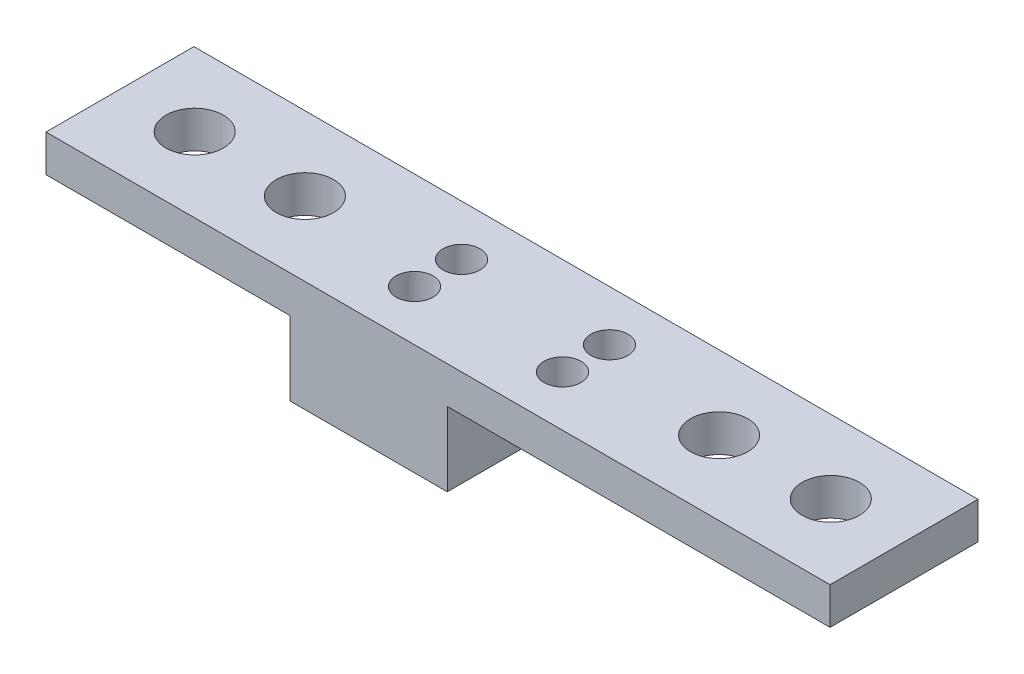
ISO-10303-21;
HEADER;
FILE_DESCRIPTION(('STEP AP214'),'2;1');
FILE_NAME('part.step','',(''),(''),'','','');
FILE_SCHEMA(('AUTOMOTIVE_DESIGN { 1 0 10303 214 1 1 1 1 }'));
ENDSEC;
DATA;
#1=APPLICATION_CONTEXT('core data for automotive mechanical design processes');
#2=APPLICATION_PROTOCOL_DEFINITION('international standard','automotive_design',2000,#1);
#3=PRODUCT_CONTEXT('',#1,'mechanical');
#4=PRODUCT('Part','Part','',(#3));
#5=PRODUCT_RELATED_PRODUCT_CATEGORY('part','',(#4));
#6=PRODUCT_DEFINITION_FORMATION('','',#4);
#7=PRODUCT_DEFINITION_CONTEXT('part definition',#1,'design');
#8=PRODUCT_DEFINITION('design','',#6,#7);
#9=PRODUCT_DEFINITION_SHAPE('','',#8);
#10=(LENGTH_UNIT() NAMED_UNIT(*) SI_UNIT(.MILLI.,.METRE.));
#11=(NAMED_UNIT(*) PLANE_ANGLE_UNIT() SI_UNIT($,.RADIAN.));
#12=(NAMED_UNIT(*) SI_UNIT($,.STERADIAN.) SOLID_ANGLE_UNIT());
#13=UNCERTAINTY_MEASURE_WITH_UNIT(LENGTH_MEASURE(1.E-05),#10,'distance_accuracy_value','');
#14=(GEOMETRIC_REPRESENTATION_CONTEXT(3) GLOBAL_UNCERTAINTY_ASSIGNED_CONTEXT((#13)) GLOBAL_UNIT_ASSIGNED_CONTEXT((#10,
#11,#12)) REPRESENTATION_CONTEXT('',''));
#15=CARTESIAN_POINT('',(0.,0.,0.));
#16=DIRECTION('',(0.,0.,1.));
#17=DIRECTION('',(1.,0.,0.));
#18=AXIS2_PLACEMENT_3D('',#15,#16,#17);
#19=CARTESIAN_POINT('',(0.,0.,0.));
#20=DIRECTION('',(0.,-1.,0.));
#21=DIRECTION('',(0.,0.,-1.));
#22=AXIS2_PLACEMENT_3D('',#19,#20,#21);
#23=PLANE('',#22);
#24=CARTESIAN_POINT('',(-11.2,0.,0.));
#25=DIRECTION('',(0.,1.,0.));
#26=DIRECTION('',(0.,0.,1.));
#27=AXIS2_PLACEMENT_3D('',#24,#25,#26);
#28=CIRCLE('',#27,1.55);
#29=CARTESIAN_POINT('',(-11.2,0.,1.55));
#30=VERTEX_POINT('',#29);
#31=EDGE_CURVE('E190',#30,#30,#28,.T.);
#32=ORIENTED_EDGE('',*,*,#31,.T.);
#33=EDGE_LOOP('',(#32));
#34=FACE_BOUND('',#33,.T.);
#35=DIRECTION('',(-1.,0.,0.));
#36=VECTOR('',#35,1.);
#37=CARTESIAN_POINT('',(-15.2,0.,-4.));
#38=LINE('',#37,#36);
#39=CARTESIAN_POINT('',(-8.,0.,-4.00000000000001));
#40=VERTEX_POINT('',#39);
#41=CARTESIAN_POINT('',(-21.2,0.,-4.));
#42=VERTEX_POINT('',#41);
#43=EDGE_CURVE('E105',#40,#42,#38,.T.);
#44=ORIENTED_EDGE('',*,*,#43,.F.);
#45=DIRECTION('',(0.,0.,-1.));
#46=VECTOR('',#45,1.);
#47=CARTESIAN_POINT('',(-8.,0.,-4.00000000000001));
#48=LINE('',#47,#46);
#49=CARTESIAN_POINT('',(-8.,0.,4.00000000000001));
#50=VERTEX_POINT('',#49);
#51=EDGE_CURVE('E141',#50,#40,#48,.T.);
#52=ORIENTED_EDGE('',*,*,#51,.F.);
#53=DIRECTION('',(1.,0.,0.));
#54=VECTOR('',#53,1.);
#55=CARTESIAN_POINT('',(-15.2,0.,4.00000000000001));
#56=LINE('',#55,#54);
#57=CARTESIAN_POINT('',(-21.2,0.,4.00000000000001));
#58=VERTEX_POINT('',#57);
#59=EDGE_CURVE('E37',#58,#50,#56,.T.);
#60=ORIENTED_EDGE('',*,*,#59,.F.);
#61=DIRECTION('',(0.,0.,1.));
#62=VECTOR('',#61,1.);
#63=CARTESIAN_POINT('',(-21.2,0.,4.00000000000001));
#64=LINE('',#63,#62);
#65=EDGE_CURVE('E134',#42,#58,#64,.T.);
#66=ORIENTED_EDGE('',*,*,#65,.F.);
#67=EDGE_LOOP('',(#44,#52,#60,#66));
#68=FACE_BOUND('',#67,.T.);
#69=CARTESIAN_POINT('',(-17.2,0.,-0.0401412742934725));
#70=DIRECTION('',(0.,-1.,0.));
#71=DIRECTION('',(0.,0.,-1.));
#72=AXIS2_PLACEMENT_3D('',#69,#70,#71);
#73=CIRCLE('',#72,1.55);
#74=CARTESIAN_POINT('',(-17.2,0.,1.50985872570653));
#75=VERTEX_POINT('',#74);
#76=EDGE_CURVE('E126',#75,#75,#73,.F.);
#77=ORIENTED_EDGE('',*,*,#76,.T.);
#78=EDGE_LOOP('',(#77));
#79=FACE_BOUND('',#78,.T.);
#80=ADVANCED_FACE('F33',(#34,#68,#79),#23,.T.);
#81=DIRECTION('',(0.,0.,1.));
#82=VECTOR('',#81,1.);
#83=CARTESIAN_POINT('',(0.5,0.,-4.00000000000001));
#84=LINE('',#83,#82);
#85=CARTESIAN_POINT('',(0.5,0.,-4.));
#86=VERTEX_POINT('',#85);
#87=CARTESIAN_POINT('',(0.499999999999999,0.,4.00000000000001));
#88=VERTEX_POINT('',#87);
#89=EDGE_CURVE('E50',#86,#88,#84,.T.);
#90=ORIENTED_EDGE('',*,*,#89,.F.);
#91=CARTESIAN_POINT('',(21.2,0.,-4.00000000000001));
#92=VERTEX_POINT('',#91);
#93=EDGE_CURVE('E95',#92,#86,#38,.T.);
#94=ORIENTED_EDGE('',*,*,#93,.F.);
#95=DIRECTION('',(0.,0.,-1.));
#96=VECTOR('',#95,1.);
#97=CARTESIAN_POINT('',(21.2,0.,4.));
#98=LINE('',#97,#96);
#99=CARTESIAN_POINT('',(21.2,0.,4.));
#100=VERTEX_POINT('',#99);
#101=EDGE_CURVE('E100',#100,#92,#98,.T.);
#102=ORIENTED_EDGE('',*,*,#101,.F.);
#103=EDGE_CURVE('E55',#88,#100,#56,.T.);
#104=ORIENTED_EDGE('',*,*,#103,.F.);
#105=EDGE_LOOP('',(#90,#94,#102,#104));
#106=FACE_BOUND('',#105,.T.);
#107=CARTESIAN_POINT('',(4.,0.,1.27));
#108=DIRECTION('',(0.,1.,0.));
#109=DIRECTION('',(0.,0.,1.));
#110=AXIS2_PLACEMENT_3D('',#107,#108,#109);
#111=CIRCLE('',#110,1.);
#112=CARTESIAN_POINT('',(4.,0.,2.27));
#113=VERTEX_POINT('',#112);
#114=EDGE_CURVE('E168',#113,#113,#111,.T.);
#115=ORIENTED_EDGE('',*,*,#114,.T.);
#116=EDGE_LOOP('',(#115));
#117=FACE_BOUND('',#116,.T.);
#118=CARTESIAN_POINT('',(11.2,0.,0.));
#119=DIRECTION('',(0.,1.,0.));
#120=DIRECTION('',(0.,0.,-1.));
#121=AXIS2_PLACEMENT_3D('',#118,#119,#120);
#122=CIRCLE('',#121,1.55);
#123=CARTESIAN_POINT('',(11.2,0.,-1.55));
#124=VERTEX_POINT('',#123);
#125=EDGE_CURVE('E186',#124,#124,#122,.T.);
#126=ORIENTED_EDGE('',*,*,#125,.T.);
#127=EDGE_LOOP('',(#126));
#128=FACE_BOUND('',#127,.T.);
#129=CARTESIAN_POINT('',(4.,0.,-1.27));
#130=DIRECTION('',(0.,1.,0.));
#131=DIRECTION('',(0.,0.,1.));
#132=AXIS2_PLACEMENT_3D('',#129,#130,#131);
#133=CIRCLE('',#132,1.);
#134=CARTESIAN_POINT('',(4.,0.,-0.270000000000001));
#135=VERTEX_POINT('',#134);
#136=EDGE_CURVE('E172',#135,#135,#133,.T.);
#137=ORIENTED_EDGE('',*,*,#136,.T.);
#138=EDGE_LOOP('',(#137));
#139=FACE_BOUND('',#138,.T.);
#140=CARTESIAN_POINT('',(17.2,0.,-0.0401412742934767));
#141=DIRECTION('',(0.,-1.,0.));
#142=DIRECTION('',(0.,0.,-1.));
#143=AXIS2_PLACEMENT_3D('',#140,#141,#142);
#144=CIRCLE('',#143,1.55);
#145=CARTESIAN_POINT('',(17.2,0.,1.50985872570652));
#146=VERTEX_POINT('',#145);
#147=EDGE_CURVE('E120',#146,#146,#144,.F.);
#148=ORIENTED_EDGE('',*,*,#147,.T.);
#149=EDGE_LOOP('',(#148));
#150=FACE_BOUND('',#149,.T.);
#151=ADVANCED_FACE('F97',(#106,#117,#128,#139,#150),#23,.T.);
#152=CARTESIAN_POINT('',(0.,2.,0.));
#153=DIRECTION('',(0.,-1.,0.));
#154=DIRECTION('',(0.,0.,-1.));
#155=AXIS2_PLACEMENT_3D('',#152,#153,#154);
#156=PLANE('',#155);
#157=DIRECTION('',(1.,0.,0.));
#158=VECTOR('',#157,1.);
#159=CARTESIAN_POINT('',(-15.2,2.,4.00000000000001));
#160=LINE('',#159,#158);
#161=CARTESIAN_POINT('',(-21.2,2.,4.00000000000001));
#162=VERTEX_POINT('',#161);
#163=CARTESIAN_POINT('',(21.2,2.,4.));
#164=VERTEX_POINT('',#163);
#165=EDGE_CURVE('E11',#162,#164,#160,.T.);
#166=ORIENTED_EDGE('',*,*,#165,.T.);
#167=DIRECTION('',(0.,0.,-1.));
#168=VECTOR('',#167,1.);
#169=CARTESIAN_POINT('',(21.2,2.,4.));
#170=LINE('',#169,#168);
#171=CARTESIAN_POINT('',(21.2,2.,-4.00000000000001));
#172=VERTEX_POINT('',#171);
#173=EDGE_CURVE('E226',#164,#172,#170,.T.);
#174=ORIENTED_EDGE('',*,*,#173,.T.);
#175=DIRECTION('',(-1.,0.,0.));
#176=VECTOR('',#175,1.);
#177=CARTESIAN_POINT('',(-15.2,2.,-4.));
#178=LINE('',#177,#176);
#179=CARTESIAN_POINT('',(-21.2,2.,-4.));
#180=VERTEX_POINT('',#179);
#181=EDGE_CURVE('E42',#172,#180,#178,.T.);
#182=ORIENTED_EDGE('',*,*,#181,.T.);
#183=DIRECTION('',(0.,0.,1.));
#184=VECTOR('',#183,1.);
#185=CARTESIAN_POINT('',(-21.2,2.,4.00000000000001));
#186=LINE('',#185,#184);
#187=EDGE_CURVE('E123',#180,#162,#186,.T.);
#188=ORIENTED_EDGE('',*,*,#187,.T.);
#189=EDGE_LOOP('',(#166,#174,#182,#188));
#190=FACE_BOUND('',#189,.T.);
#191=CARTESIAN_POINT('',(-11.2,2.,0.));
#192=DIRECTION('',(0.,1.,0.));
#193=DIRECTION('',(0.,0.,1.));
#194=AXIS2_PLACEMENT_3D('',#191,#192,#193);
#195=CIRCLE('',#194,1.55);
#196=CARTESIAN_POINT('',(-11.2,2.,1.55));
#197=VERTEX_POINT('',#196);
#198=EDGE_CURVE('E193',#197,#197,#195,.T.);
#199=ORIENTED_EDGE('',*,*,#198,.F.);
#200=EDGE_LOOP('',(#199));
#201=FACE_BOUND('',#200,.T.);
#202=CARTESIAN_POINT('',(11.2,2.,0.));
#203=DIRECTION('',(0.,1.,0.));
#204=DIRECTION('',(0.,0.,-1.));
#205=AXIS2_PLACEMENT_3D('',#202,#203,#204);
#206=CIRCLE('',#205,1.55);
#207=CARTESIAN_POINT('',(11.2,2.,-1.55));
#208=VERTEX_POINT('',#207);
#209=EDGE_CURVE('E187',#208,#208,#206,.T.);
#210=ORIENTED_EDGE('',*,*,#209,.F.);
#211=EDGE_LOOP('',(#210));
#212=FACE_BOUND('',#211,.T.);
#213=CARTESIAN_POINT('',(-4.,2.,1.27));
#214=DIRECTION('',(0.,1.,0.));
#215=DIRECTION('',(0.,0.,1.));
#216=AXIS2_PLACEMENT_3D('',#213,#214,#215);
#217=CIRCLE('',#216,1.);
#218=CARTESIAN_POINT('',(-4.,2.,2.27));
#219=VERTEX_POINT('',#218);
#220=EDGE_CURVE('E183',#219,#219,#217,.T.);
#221=ORIENTED_EDGE('',*,*,#220,.F.);
#222=EDGE_LOOP('',(#221));
#223=FACE_BOUND('',#222,.T.);
#224=CARTESIAN_POINT('',(-4.,2.,-1.27));
#225=DIRECTION('',(0.,1.,0.));
#226=DIRECTION('',(0.,0.,1.));
#227=AXIS2_PLACEMENT_3D('',#224,#225,#226);
#228=CIRCLE('',#227,1.);
#229=CARTESIAN_POINT('',(-4.,2.,-0.27));
#230=VERTEX_POINT('',#229);
#231=EDGE_CURVE('E178',#230,#230,#228,.T.);
#232=ORIENTED_EDGE('',*,*,#231,.F.);
#233=EDGE_LOOP('',(#232));
#234=FACE_BOUND('',#233,.T.);
#235=CARTESIAN_POINT('',(4.,2.,-1.27));
#236=DIRECTION('',(0.,1.,0.));
#237=DIRECTION('',(0.,0.,1.));
#238=AXIS2_PLACEMENT_3D('',#235,#236,#237);
#239=CIRCLE('',#238,1.);
#240=CARTESIAN_POINT('',(4.,2.,-0.270000000000001));
#241=VERTEX_POINT('',#240);
#242=EDGE_CURVE('E175',#241,#241,#239,.T.);
#243=ORIENTED_EDGE('',*,*,#242,.F.);
#244=EDGE_LOOP('',(#243));
#245=FACE_BOUND('',#244,.T.);
#246=CARTESIAN_POINT('',(4.,2.,1.27));
#247=DIRECTION('',(0.,1.,0.));
#248=DIRECTION('',(0.,0.,1.));
#249=AXIS2_PLACEMENT_3D('',#246,#247,#248);
#250=CIRCLE('',#249,1.);
#251=CARTESIAN_POINT('',(4.,2.,2.27));
#252=VERTEX_POINT('',#251);
#253=EDGE_CURVE('E169',#252,#252,#250,.T.);
#254=ORIENTED_EDGE('',*,*,#253,.F.);
#255=EDGE_LOOP('',(#254));
#256=FACE_BOUND('',#255,.T.);
#257=CARTESIAN_POINT('',(-17.2,2.,-0.0401412742934725));
#258=DIRECTION('',(0.,1.,0.));
#259=DIRECTION('',(0.,0.,1.));
#260=AXIS2_PLACEMENT_3D('',#257,#258,#259);
#261=CIRCLE('',#260,1.55);
#262=CARTESIAN_POINT('',(-17.2,2.,1.50985872570653));
#263=VERTEX_POINT('',#262);
#264=EDGE_CURVE('E127',#263,#263,#261,.T.);
#265=ORIENTED_EDGE('',*,*,#264,.F.);
#266=EDGE_LOOP('',(#265));
#267=FACE_BOUND('',#266,.T.);
#268=CARTESIAN_POINT('',(17.2,2.,-0.0401412742934767));
#269=DIRECTION('',(0.,1.,0.));
#270=DIRECTION('',(0.,0.,-1.));
#271=AXIS2_PLACEMENT_3D('',#268,#269,#270);
#272=CIRCLE('',#271,1.55);
#273=CARTESIAN_POINT('',(17.2,2.,1.50985872570652));
#274=VERTEX_POINT('',#273);
#275=EDGE_CURVE('E112',#274,#274,#272,.T.);
#276=ORIENTED_EDGE('',*,*,#275,.F.);
#277=EDGE_LOOP('',(#276));
#278=FACE_BOUND('',#277,.T.);
#279=ADVANCED_FACE('F224',(#190,#201,#212,#223,#234,#245,#256,#267,#278),#156,.F.);
#280=CARTESIAN_POINT('',(-15.2,2.,-4.));
#281=DIRECTION('',(0.,0.,1.));
#282=DIRECTION('',(1.,0.,0.));
#283=AXIS2_PLACEMENT_3D('',#280,#281,#282);
#284=PLANE('',#283);
#285=DIRECTION('',(0.,1.,0.));
#286=VECTOR('',#285,1.);
#287=CARTESIAN_POINT('',(-8.,-14.9658560997307,-4.00000000000001));
#288=LINE('',#287,#286);
#289=CARTESIAN_POINT('',(-8.,-4.,-4.00000000000001));
#290=VERTEX_POINT('',#289);
#291=EDGE_CURVE('E144',#290,#40,#288,.T.);
#292=ORIENTED_EDGE('',*,*,#291,.T.);
#293=ORIENTED_EDGE('',*,*,#43,.T.);
#294=DIRECTION('',(0.,1.,0.));
#295=VECTOR('',#294,1.);
#296=CARTESIAN_POINT('',(-21.2,-10.,-4.));
#297=LINE('',#296,#295);
#298=EDGE_CURVE('E130',#42,#180,#297,.T.);
#299=ORIENTED_EDGE('',*,*,#298,.T.);
#300=ORIENTED_EDGE('',*,*,#181,.F.);
#301=DIRECTION('',(0.,1.,0.));
#302=VECTOR('',#301,1.);
#303=CARTESIAN_POINT('',(21.2,-10.,-4.00000000000001));
#304=LINE('',#303,#302);
#305=EDGE_CURVE('E107',#92,#172,#304,.T.);
#306=ORIENTED_EDGE('',*,*,#305,.F.);
#307=ORIENTED_EDGE('',*,*,#93,.T.);
#308=DIRECTION('',(0.,1.,0.));
#309=VECTOR('',#308,1.);
#310=CARTESIAN_POINT('',(0.5,-4.,-4.00000000000001));
#311=LINE('',#310,#309);
#312=CARTESIAN_POINT('',(0.5,-4.,-4.00000000000001));
#313=VERTEX_POINT('',#312);
#314=EDGE_CURVE('E163',#313,#86,#311,.T.);
#315=ORIENTED_EDGE('',*,*,#314,.F.);
#316=DIRECTION('',(1.,0.,0.));
#317=VECTOR('',#316,1.);
#318=CARTESIAN_POINT('',(-0.5,-4.,-4.00000000000001));
#319=LINE('',#318,#317);
#320=EDGE_CURVE('E161',#290,#313,#319,.T.);
#321=ORIENTED_EDGE('',*,*,#320,.F.);
#322=EDGE_LOOP('',(#292,#293,#299,#300,#306,#307,#315,#321));
#323=FACE_BOUND('',#322,.T.);
#324=ADVANCED_FACE('F35',(#323),#284,.F.);
#325=CARTESIAN_POINT('',(-15.2,2.,4.00000000000001));
#326=DIRECTION('',(0.,0.,-1.));
#327=DIRECTION('',(-1.,0.,0.));
#328=AXIS2_PLACEMENT_3D('',#325,#326,#327);
#329=PLANE('',#328);
#330=ORIENTED_EDGE('',*,*,#59,.T.);
#331=DIRECTION('',(0.,1.,0.));
#332=VECTOR('',#331,1.);
#333=CARTESIAN_POINT('',(-8.,-14.9658560997307,4.00000000000001));
#334=LINE('',#333,#332);
#335=CARTESIAN_POINT('',(-8.,-4.,4.00000000000001));
#336=VERTEX_POINT('',#335);
#337=EDGE_CURVE('E145',#336,#50,#334,.T.);
#338=ORIENTED_EDGE('',*,*,#337,.F.);
#339=DIRECTION('',(-1.,0.,0.));
#340=VECTOR('',#339,1.);
#341=CARTESIAN_POINT('',(-0.5,-4.,4.00000000000001));
#342=LINE('',#341,#340);
#343=CARTESIAN_POINT('',(0.5,-4.,4.00000000000001));
#344=VERTEX_POINT('',#343);
#345=EDGE_CURVE('E159',#344,#336,#342,.T.);
#346=ORIENTED_EDGE('',*,*,#345,.F.);
#347=DIRECTION('',(0.,1.,0.));
#348=VECTOR('',#347,1.);
#349=CARTESIAN_POINT('',(0.5,-4.,4.00000000000001));
#350=LINE('',#349,#348);
#351=EDGE_CURVE('E166',#344,#88,#350,.T.);
#352=ORIENTED_EDGE('',*,*,#351,.T.);
#353=ORIENTED_EDGE('',*,*,#103,.T.);
#354=DIRECTION('',(0.,1.,0.));
#355=VECTOR('',#354,1.);
#356=CARTESIAN_POINT('',(21.2,-10.,4.));
#357=LINE('',#356,#355);
#358=EDGE_CURVE('E116',#100,#164,#357,.T.);
#359=ORIENTED_EDGE('',*,*,#358,.T.);
#360=ORIENTED_EDGE('',*,*,#165,.F.);
#361=DIRECTION('',(0.,1.,0.));
#362=VECTOR('',#361,1.);
#363=CARTESIAN_POINT('',(-21.2,-10.,4.00000000000001));
#364=LINE('',#363,#362);
#365=EDGE_CURVE('E137',#58,#162,#364,.T.);
#366=ORIENTED_EDGE('',*,*,#365,.F.);
#367=EDGE_LOOP('',(#330,#338,#346,#352,#353,#359,#360,#366));
#368=FACE_BOUND('',#367,.T.);
#369=ADVANCED_FACE('F203',(#368),#329,.F.);
#370=CARTESIAN_POINT('',(-11.2,2.,0.));
#371=DIRECTION('',(0.,-1.,0.));
#372=DIRECTION('',(0.,0.,-1.));
#373=AXIS2_PLACEMENT_3D('',#370,#371,#372);
#374=CYLINDRICAL_SURFACE('',#373,1.55);
#375=ORIENTED_EDGE('',*,*,#198,.T.);
#376=EDGE_LOOP('',(#375));
#377=FACE_BOUND('',#376,.T.);
#378=ORIENTED_EDGE('',*,*,#31,.F.);
#379=EDGE_LOOP('',(#378));
#380=FACE_BOUND('',#379,.T.);
#381=ADVANCED_FACE('F249',(#377,#380),#374,.F.);
#382=CARTESIAN_POINT('',(11.2,2.,0.));
#383=DIRECTION('',(0.,-1.,0.));
#384=DIRECTION('',(0.,0.,-1.));
#385=AXIS2_PLACEMENT_3D('',#382,#383,#384);
#386=CYLINDRICAL_SURFACE('',#385,1.55);
#387=ORIENTED_EDGE('',*,*,#209,.T.);
#388=EDGE_LOOP('',(#387));
#389=FACE_BOUND('',#388,.T.);
#390=ORIENTED_EDGE('',*,*,#125,.F.);
#391=EDGE_LOOP('',(#390));
#392=FACE_BOUND('',#391,.T.);
#393=ADVANCED_FACE('F254',(#389,#392),#386,.F.);
#394=CARTESIAN_POINT('',(-4.,2.,1.27));
#395=DIRECTION('',(0.,-1.,0.));
#396=DIRECTION('',(0.,0.,-1.));
#397=AXIS2_PLACEMENT_3D('',#394,#395,#396);
#398=CYLINDRICAL_SURFACE('',#397,1.);
#399=ORIENTED_EDGE('',*,*,#220,.T.);
#400=EDGE_LOOP('',(#399));
#401=FACE_BOUND('',#400,.T.);
#402=CARTESIAN_POINT('',(-4.,-4.,1.27));
#403=DIRECTION('',(0.,1.,0.));
#404=DIRECTION('',(0.,0.,1.));
#405=AXIS2_PLACEMENT_3D('',#402,#403,#404);
#406=CIRCLE('',#405,1.);
#407=CARTESIAN_POINT('',(-4.,-4.,2.27));
#408=VERTEX_POINT('',#407);
#409=EDGE_CURVE('E151',#408,#408,#406,.T.);
#410=ORIENTED_EDGE('',*,*,#409,.F.);
#411=EDGE_LOOP('',(#410));
#412=FACE_BOUND('',#411,.T.);
#413=ADVANCED_FACE('F259',(#401,#412),#398,.F.);
#414=CARTESIAN_POINT('',(-4.,2.,-1.27));
#415=DIRECTION('',(0.,-1.,0.));
#416=DIRECTION('',(0.,0.,-1.));
#417=AXIS2_PLACEMENT_3D('',#414,#415,#416);
#418=CYLINDRICAL_SURFACE('',#417,1.);
#419=ORIENTED_EDGE('',*,*,#231,.T.);
#420=EDGE_LOOP('',(#419));
#421=FACE_BOUND('',#420,.T.);
#422=CARTESIAN_POINT('',(-4.,-4.,-1.27));
#423=DIRECTION('',(0.,1.,0.));
#424=DIRECTION('',(0.,0.,1.));
#425=AXIS2_PLACEMENT_3D('',#422,#423,#424);
#426=CIRCLE('',#425,1.);
#427=CARTESIAN_POINT('',(-4.,-4.,-0.27));
#428=VERTEX_POINT('',#427);
#429=EDGE_CURVE('E148',#428,#428,#426,.T.);
#430=ORIENTED_EDGE('',*,*,#429,.F.);
#431=EDGE_LOOP('',(#430));
#432=FACE_BOUND('',#431,.T.);
#433=ADVANCED_FACE('F266',(#421,#432),#418,.F.);
#434=CARTESIAN_POINT('',(4.,2.,-1.27));
#435=DIRECTION('',(0.,-1.,0.));
#436=DIRECTION('',(0.,0.,-1.));
#437=AXIS2_PLACEMENT_3D('',#434,#435,#436);
#438=CYLINDRICAL_SURFACE('',#437,1.);
#439=ORIENTED_EDGE('',*,*,#242,.T.);
#440=EDGE_LOOP('',(#439));
#441=FACE_BOUND('',#440,.T.);
#442=ORIENTED_EDGE('',*,*,#136,.F.);
#443=EDGE_LOOP('',(#442));
#444=FACE_BOUND('',#443,.T.);
#445=ADVANCED_FACE('F270',(#441,#444),#438,.F.);
#446=CARTESIAN_POINT('',(4.,2.,1.27));
#447=DIRECTION('',(0.,-1.,0.));
#448=DIRECTION('',(0.,0.,-1.));
#449=AXIS2_PLACEMENT_3D('',#446,#447,#448);
#450=CYLINDRICAL_SURFACE('',#449,1.);
#451=ORIENTED_EDGE('',*,*,#253,.T.);
#452=EDGE_LOOP('',(#451));
#453=FACE_BOUND('',#452,.T.);
#454=ORIENTED_EDGE('',*,*,#114,.F.);
#455=EDGE_LOOP('',(#454));
#456=FACE_BOUND('',#455,.T.);
#457=ADVANCED_FACE('F274',(#453,#456),#450,.F.);
#458=CARTESIAN_POINT('',(0.5,-4.,-4.00000000000001));
#459=DIRECTION('',(-1.,0.,0.));
#460=DIRECTION('',(0.,0.,1.));
#461=AXIS2_PLACEMENT_3D('',#458,#459,#460);
#462=PLANE('',#461);
#463=ORIENTED_EDGE('',*,*,#89,.T.);
#464=ORIENTED_EDGE('',*,*,#351,.F.);
#465=DIRECTION('',(0.,0.,1.));
#466=VECTOR('',#465,1.);
#467=CARTESIAN_POINT('',(0.5,-4.,-4.00000000000001));
#468=LINE('',#467,#466);
#469=EDGE_CURVE('E156',#313,#344,#468,.T.);
#470=ORIENTED_EDGE('',*,*,#469,.F.);
#471=ORIENTED_EDGE('',*,*,#314,.T.);
#472=EDGE_LOOP('',(#463,#464,#470,#471));
#473=FACE_BOUND('',#472,.T.);
#474=ADVANCED_FACE('F207',(#473),#462,.F.);
#475=CARTESIAN_POINT('',(0.,-4.,0.));
#476=DIRECTION('',(0.,1.,0.));
#477=DIRECTION('',(0.,0.,1.));
#478=AXIS2_PLACEMENT_3D('',#475,#476,#477);
#479=PLANE('',#478);
#480=ORIENTED_EDGE('',*,*,#469,.T.);
#481=ORIENTED_EDGE('',*,*,#345,.T.);
#482=DIRECTION('',(0.,0.,1.));
#483=VECTOR('',#482,1.);
#484=CARTESIAN_POINT('',(-8.,-4.,-4.00000000000001));
#485=LINE('',#484,#483);
#486=EDGE_CURVE('E133',#290,#336,#485,.T.);
#487=ORIENTED_EDGE('',*,*,#486,.F.);
#488=ORIENTED_EDGE('',*,*,#320,.T.);
#489=EDGE_LOOP('',(#480,#481,#487,#488));
#490=FACE_BOUND('',#489,.T.);
#491=ORIENTED_EDGE('',*,*,#429,.T.);
#492=EDGE_LOOP('',(#491));
#493=FACE_BOUND('',#492,.T.);
#494=ORIENTED_EDGE('',*,*,#409,.T.);
#495=EDGE_LOOP('',(#494));
#496=FACE_BOUND('',#495,.T.);
#497=ADVANCED_FACE('F211',(#490,#493,#496),#479,.F.);
#498=CARTESIAN_POINT('',(-8.,-14.9658560997307,-4.00000000000001));
#499=DIRECTION('',(1.,0.,0.));
#500=DIRECTION('',(0.,0.,-1.));
#501=AXIS2_PLACEMENT_3D('',#498,#499,#500);
#502=PLANE('',#501);
#503=ORIENTED_EDGE('',*,*,#291,.F.);
#504=ORIENTED_EDGE('',*,*,#486,.T.);
#505=ORIENTED_EDGE('',*,*,#337,.T.);
#506=ORIENTED_EDGE('',*,*,#51,.T.);
#507=EDGE_LOOP('',(#503,#504,#505,#506));
#508=FACE_BOUND('',#507,.T.);
#509=ADVANCED_FACE('F214',(#508),#502,.F.);
#510=CARTESIAN_POINT('',(-21.2,-10.,4.00000000000001));
#511=DIRECTION('',(-1.,0.,0.));
#512=DIRECTION('',(0.,0.,1.));
#513=AXIS2_PLACEMENT_3D('',#510,#511,#512);
#514=PLANE('',#513);
#515=ORIENTED_EDGE('',*,*,#298,.F.);
#516=ORIENTED_EDGE('',*,*,#65,.T.);
#517=ORIENTED_EDGE('',*,*,#365,.T.);
#518=ORIENTED_EDGE('',*,*,#187,.F.);
#519=EDGE_LOOP('',(#515,#516,#517,#518));
#520=FACE_BOUND('',#519,.T.);
#521=ADVANCED_FACE('F223',(#520),#514,.T.);
#522=CARTESIAN_POINT('',(-17.2,-10.,-0.0401412742934725));
#523=DIRECTION('',(0.,1.,0.));
#524=DIRECTION('',(0.,0.,1.));
#525=AXIS2_PLACEMENT_3D('',#522,#523,#524);
#526=CYLINDRICAL_SURFACE('',#525,1.55);
#527=CARTESIAN_POINT('',(-17.2,2.,1.50985872570653));
#528=CARTESIAN_POINT('',(-17.2,1.97916666666667,1.50985872570653));
#529=CARTESIAN_POINT('',(-17.2,1.95833333333333,1.50985872570653));
#530=CARTESIAN_POINT('',(-17.2,1.91666666666666,1.50985872570653));
#531=CARTESIAN_POINT('',(-17.2,1.89583333333333,1.50985872570653));
#532=CARTESIAN_POINT('',(-17.2,1.85416666666666,1.50985872570653));
#533=CARTESIAN_POINT('',(-17.2,1.83333333333333,1.50985872570653));
#534=CARTESIAN_POINT('',(-17.2,1.79166666666666,1.50985872570653));
#535=CARTESIAN_POINT('',(-17.2,1.77083333333333,1.50985872570653));
#536=CARTESIAN_POINT('',(-17.2,1.72916666666666,1.50985872570653));
#537=CARTESIAN_POINT('',(-17.2,1.70833333333333,1.50985872570653));
#538=CARTESIAN_POINT('',(-17.2,1.66666666666666,1.50985872570653));
#539=CARTESIAN_POINT('',(-17.2,1.64583333333333,1.50985872570653));
#540=CARTESIAN_POINT('',(-17.2,1.60416666666666,1.50985872570653));
#541=CARTESIAN_POINT('',(-17.2,1.58333333333333,1.50985872570653));
#542=CARTESIAN_POINT('',(-17.2,1.54166666666666,1.50985872570653));
#543=CARTESIAN_POINT('',(-17.2,1.52083333333333,1.50985872570653));
#544=CARTESIAN_POINT('',(-17.2,1.47916666666667,1.50985872570653));
#545=CARTESIAN_POINT('',(-17.2,1.45833333333333,1.50985872570653));
#546=CARTESIAN_POINT('',(-17.2,1.41666666666667,1.50985872570653));
#547=CARTESIAN_POINT('',(-17.2,1.39583333333333,1.50985872570653));
#548=CARTESIAN_POINT('',(-17.2,1.35416666666667,1.50985872570653));
#549=CARTESIAN_POINT('',(-17.2,1.33333333333333,1.50985872570653));
#550=CARTESIAN_POINT('',(-17.2,1.29166666666667,1.50985872570653));
#551=CARTESIAN_POINT('',(-17.2,1.27083333333333,1.50985872570653));
#552=CARTESIAN_POINT('',(-17.2,1.22916666666667,1.50985872570653));
#553=CARTESIAN_POINT('',(-17.2,1.20833333333333,1.50985872570653));
#554=CARTESIAN_POINT('',(-17.2,1.16666666666667,1.50985872570653));
#555=CARTESIAN_POINT('',(-17.2,1.14583333333333,1.50985872570653));
#556=CARTESIAN_POINT('',(-17.2,1.10416666666667,1.50985872570653));
#557=CARTESIAN_POINT('',(-17.2,1.08333333333333,1.50985872570653));
#558=CARTESIAN_POINT('',(-17.2,1.04166666666667,1.50985872570653));
#559=CARTESIAN_POINT('',(-17.2,1.02083333333333,1.50985872570653));
#560=CARTESIAN_POINT('',(-17.2,0.979166666666666,1.50985872570653));
#561=CARTESIAN_POINT('',(-17.2,0.958333333333332,1.50985872570653));
#562=CARTESIAN_POINT('',(-17.2,0.916666666666666,1.50985872570653));
#563=CARTESIAN_POINT('',(-17.2,0.895833333333332,1.50985872570653));
#564=CARTESIAN_POINT('',(-17.2,0.854166666666666,1.50985872570653));
#565=CARTESIAN_POINT('',(-17.2,0.833333333333332,1.50985872570653));
#566=CARTESIAN_POINT('',(-17.2,0.791666666666666,1.50985872570653));
#567=CARTESIAN_POINT('',(-17.2,0.770833333333332,1.50985872570653));
#568=CARTESIAN_POINT('',(-17.2,0.729166666666666,1.50985872570653));
#569=CARTESIAN_POINT('',(-17.2,0.708333333333332,1.50985872570653));
#570=CARTESIAN_POINT('',(-17.2,0.666666666666666,1.50985872570653));
#571=CARTESIAN_POINT('',(-17.2,0.645833333333332,1.50985872570653));
#572=CARTESIAN_POINT('',(-17.2,0.604166666666666,1.50985872570653));
#573=CARTESIAN_POINT('',(-17.2,0.583333333333333,1.50985872570653));
#574=CARTESIAN_POINT('',(-17.2,0.541666666666667,1.50985872570653));
#575=CARTESIAN_POINT('',(-17.2,0.520833333333334,1.50985872570653));
#576=CARTESIAN_POINT('',(-17.2,0.479166666666667,1.50985872570653));
#577=CARTESIAN_POINT('',(-17.2,0.458333333333334,1.50985872570653));
#578=CARTESIAN_POINT('',(-17.2,0.416666666666667,1.50985872570653));
#579=CARTESIAN_POINT('',(-17.2,0.395833333333334,1.50985872570653));
#580=CARTESIAN_POINT('',(-17.2,0.354166666666667,1.50985872570653));
#581=CARTESIAN_POINT('',(-17.2,0.333333333333334,1.50985872570653));
#582=CARTESIAN_POINT('',(-17.2,0.291666666666667,1.50985872570653));
#583=CARTESIAN_POINT('',(-17.2,0.270833333333334,1.50985872570653));
#584=CARTESIAN_POINT('',(-17.2,0.229166666666667,1.50985872570653));
#585=CARTESIAN_POINT('',(-17.2,0.208333333333334,1.50985872570653));
#586=CARTESIAN_POINT('',(-17.2,0.166666666666667,1.50985872570653));
#587=CARTESIAN_POINT('',(-17.2,0.145833333333333,1.50985872570653));
#588=CARTESIAN_POINT('',(-17.2,0.104166666666667,1.50985872570653));
#589=CARTESIAN_POINT('',(-17.2,0.0833333333333334,1.50985872570653));
#590=CARTESIAN_POINT('',(-17.2,0.0416666666666667,1.50985872570653));
#591=CARTESIAN_POINT('',(-17.2,0.0208333333333333,1.50985872570653));
#592=CARTESIAN_POINT('',(-17.2,0.,1.50985872570653));
#593=B_SPLINE_CURVE_WITH_KNOTS('',3,(#527,#528,#529,#530,#531,#532,#533,#534,#535,#536,#537,
#538,#539,#540,#541,#542,#543,#544,#545,#546,#547,#548,#549,#550,#551,#552,#553,#554,#555,#556,
#557,#558,#559,#560,#561,#562,#563,#564,#565,#566,#567,#568,#569,#570,#571,#572,#573,#574,#575,
#576,#577,#578,#579,#580,#581,#582,#583,#584,#585,#586,#587,#588,#589,#590,#591,#592),
.UNSPECIFIED.,.F.,.F.,(4,2,2,2,2,2,2,2,2,2,2,2,2,2,2,2,2,2,2,2,2,2,2,2,2,2,2,2,2,2,2,2,4),(0.,
0.0625000000000001,0.125,0.1875,0.25,0.3125,0.375,0.4375,0.5,0.562499999999999,
0.624999999999999,0.687499999999999,0.749999999999999,0.812499999999999,0.874999999999999,
0.937499999999999,0.999999999999999,1.0625,1.125,1.1875,1.25,1.3125,1.375,1.4375,1.5,1.5625,
1.625,1.6875,1.75,1.8125,1.875,1.9375,2.),.UNSPECIFIED.);
#594=EDGE_CURVE('BSEAM284',#263,#75,#593,.T.);
#595=ORIENTED_EDGE('',*,*,#264,.T.);
#596=ORIENTED_EDGE('',*,*,#76,.F.);
#597=ORIENTED_EDGE('',*,*,#594,.T.);
#598=ORIENTED_EDGE('',*,*,#594,.F.);
#599=EDGE_LOOP('',(#595,#597,#596,#598));
#600=FACE_BOUND('',#599,.T.);
#601=ADVANCED_FACE('F284',(#600),#526,.F.);
#602=CARTESIAN_POINT('',(21.2,-10.,4.));
#603=DIRECTION('',(1.,0.,0.));
#604=DIRECTION('',(0.,0.,-1.));
#605=AXIS2_PLACEMENT_3D('',#602,#603,#604);
#606=PLANE('',#605);
#607=ORIENTED_EDGE('',*,*,#358,.F.);
#608=ORIENTED_EDGE('',*,*,#101,.T.);
#609=ORIENTED_EDGE('',*,*,#305,.T.);
#610=ORIENTED_EDGE('',*,*,#173,.F.);
#611=EDGE_LOOP('',(#607,#608,#609,#610));
#612=FACE_BOUND('',#611,.T.);
#613=ADVANCED_FACE('F114',(#612),#606,.T.);
#614=CARTESIAN_POINT('',(17.2,-10.,-0.0401412742934767));
#615=DIRECTION('',(0.,1.,0.));
#616=DIRECTION('',(0.,0.,1.));
#617=AXIS2_PLACEMENT_3D('',#614,#615,#616);
#618=CYLINDRICAL_SURFACE('',#617,1.55);
#619=CARTESIAN_POINT('',(17.2,2.,1.50985872570652));
#620=CARTESIAN_POINT('',(17.2,1.97916666666667,1.50985872570652));
#621=CARTESIAN_POINT('',(17.2,1.95833333333333,1.50985872570652));
#622=CARTESIAN_POINT('',(17.2,1.91666666666666,1.50985872570652));
#623=CARTESIAN_POINT('',(17.2,1.89583333333333,1.50985872570652));
#624=CARTESIAN_POINT('',(17.2,1.85416666666666,1.50985872570652));
#625=CARTESIAN_POINT('',(17.2,1.83333333333333,1.50985872570652));
#626=CARTESIAN_POINT('',(17.2,1.79166666666666,1.50985872570652));
#627=CARTESIAN_POINT('',(17.2,1.77083333333333,1.50985872570652));
#628=CARTESIAN_POINT('',(17.2,1.72916666666666,1.50985872570652));
#629=CARTESIAN_POINT('',(17.2,1.70833333333333,1.50985872570652));
#630=CARTESIAN_POINT('',(17.2,1.66666666666666,1.50985872570652));
#631=CARTESIAN_POINT('',(17.2,1.64583333333333,1.50985872570652));
#632=CARTESIAN_POINT('',(17.2,1.60416666666666,1.50985872570652));
#633=CARTESIAN_POINT('',(17.2,1.58333333333333,1.50985872570652));
#634=CARTESIAN_POINT('',(17.2,1.54166666666666,1.50985872570652));
#635=CARTESIAN_POINT('',(17.2,1.52083333333333,1.50985872570652));
#636=CARTESIAN_POINT('',(17.2,1.47916666666667,1.50985872570652));
#637=CARTESIAN_POINT('',(17.2,1.45833333333333,1.50985872570652));
#638=CARTESIAN_POINT('',(17.2,1.41666666666667,1.50985872570652));
#639=CARTESIAN_POINT('',(17.2,1.39583333333333,1.50985872570652));
#640=CARTESIAN_POINT('',(17.2,1.35416666666667,1.50985872570652));
#641=CARTESIAN_POINT('',(17.2,1.33333333333333,1.50985872570652));
#642=CARTESIAN_POINT('',(17.2,1.29166666666667,1.50985872570652));
#643=CARTESIAN_POINT('',(17.2,1.27083333333333,1.50985872570652));
#644=CARTESIAN_POINT('',(17.2,1.22916666666667,1.50985872570652));
#645=CARTESIAN_POINT('',(17.2,1.20833333333333,1.50985872570652));
#646=CARTESIAN_POINT('',(17.2,1.16666666666667,1.50985872570652));
#647=CARTESIAN_POINT('',(17.2,1.14583333333333,1.50985872570652));
#648=CARTESIAN_POINT('',(17.2,1.10416666666667,1.50985872570652));
#649=CARTESIAN_POINT('',(17.2,1.08333333333333,1.50985872570652));
#650=CARTESIAN_POINT('',(17.2,1.04166666666667,1.50985872570652));
#651=CARTESIAN_POINT('',(17.2,1.02083333333333,1.50985872570652));
#652=CARTESIAN_POINT('',(17.2,0.979166666666666,1.50985872570652));
#653=CARTESIAN_POINT('',(17.2,0.958333333333332,1.50985872570652));
#654=CARTESIAN_POINT('',(17.2,0.916666666666666,1.50985872570652));
#655=CARTESIAN_POINT('',(17.2,0.895833333333332,1.50985872570652));
#656=CARTESIAN_POINT('',(17.2,0.854166666666666,1.50985872570652));
#657=CARTESIAN_POINT('',(17.2,0.833333333333332,1.50985872570652));
#658=CARTESIAN_POINT('',(17.2,0.791666666666666,1.50985872570652));
#659=CARTESIAN_POINT('',(17.2,0.770833333333332,1.50985872570652));
#660=CARTESIAN_POINT('',(17.2,0.729166666666666,1.50985872570652));
#661=CARTESIAN_POINT('',(17.2,0.708333333333332,1.50985872570652));
#662=CARTESIAN_POINT('',(17.2,0.666666666666666,1.50985872570652));
#663=CARTESIAN_POINT('',(17.2,0.645833333333332,1.50985872570652));
#664=CARTESIAN_POINT('',(17.2,0.604166666666666,1.50985872570652));
#665=CARTESIAN_POINT('',(17.2,0.583333333333333,1.50985872570652));
#666=CARTESIAN_POINT('',(17.2,0.541666666666667,1.50985872570652));
#667=CARTESIAN_POINT('',(17.2,0.520833333333334,1.50985872570652));
#668=CARTESIAN_POINT('',(17.2,0.479166666666667,1.50985872570652));
#669=CARTESIAN_POINT('',(17.2,0.458333333333334,1.50985872570652));
#670=CARTESIAN_POINT('',(17.2,0.416666666666667,1.50985872570652));
#671=CARTESIAN_POINT('',(17.2,0.395833333333334,1.50985872570652));
#672=CARTESIAN_POINT('',(17.2,0.354166666666667,1.50985872570652));
#673=CARTESIAN_POINT('',(17.2,0.333333333333334,1.50985872570652));
#674=CARTESIAN_POINT('',(17.2,0.291666666666667,1.50985872570652));
#675=CARTESIAN_POINT('',(17.2,0.270833333333334,1.50985872570652));
#676=CARTESIAN_POINT('',(17.2,0.229166666666667,1.50985872570652));
#677=CARTESIAN_POINT('',(17.2,0.208333333333334,1.50985872570652));
#678=CARTESIAN_POINT('',(17.2,0.166666666666667,1.50985872570652));
#679=CARTESIAN_POINT('',(17.2,0.145833333333333,1.50985872570652));
#680=CARTESIAN_POINT('',(17.2,0.104166666666667,1.50985872570652));
#681=CARTESIAN_POINT('',(17.2,0.0833333333333334,1.50985872570652));
#682=CARTESIAN_POINT('',(17.2,0.0416666666666667,1.50985872570652));
#683=CARTESIAN_POINT('',(17.2,0.0208333333333333,1.50985872570652));
#684=CARTESIAN_POINT('',(17.2,0.,1.50985872570652));
#685=B_SPLINE_CURVE_WITH_KNOTS('',3,(#619,#620,#621,#622,#623,#624,#625,#626,#627,#628,#629,
#630,#631,#632,#633,#634,#635,#636,#637,#638,#639,#640,#641,#642,#643,#644,#645,#646,#647,#648,
#649,#650,#651,#652,#653,#654,#655,#656,#657,#658,#659,#660,#661,#662,#663,#664,#665,#666,#667,
#668,#669,#670,#671,#672,#673,#674,#675,#676,#677,#678,#679,#680,#681,#682,#683,#684),
.UNSPECIFIED.,.F.,.F.,(4,2,2,2,2,2,2,2,2,2,2,2,2,2,2,2,2,2,2,2,2,2,2,2,2,2,2,2,2,2,2,2,4),(0.,
0.0625000000000001,0.125,0.1875,0.25,0.3125,0.375,0.4375,0.5,0.562499999999999,
0.624999999999999,0.687499999999999,0.749999999999999,0.812499999999999,0.874999999999999,
0.937499999999999,0.999999999999999,1.0625,1.125,1.1875,1.25,1.3125,1.375,1.4375,1.5,1.5625,
1.625,1.6875,1.75,1.8125,1.875,1.9375,2.),.UNSPECIFIED.);
#686=EDGE_CURVE('BSEAM232',#274,#146,#685,.T.);
#687=ORIENTED_EDGE('',*,*,#275,.T.);
#688=ORIENTED_EDGE('',*,*,#147,.F.);
#689=ORIENTED_EDGE('',*,*,#686,.T.);
#690=ORIENTED_EDGE('',*,*,#686,.F.);
#691=EDGE_LOOP('',(#687,#689,#688,#690));
#692=FACE_BOUND('',#691,.T.);
#693=ADVANCED_FACE('F232',(#692),#618,.F.);
#694=CLOSED_SHELL('',(#80,#151,#279,#324,#369,#381,#393,#413,#433,#445,#457,#474,#497,#509,#521,
#601,#613,#693));
#695=MANIFOLD_SOLID_BREP('B2',#694);
#696=ADVANCED_BREP_SHAPE_REPRESENTATION('',(#18,#695),#14);
#697=SHAPE_DEFINITION_REPRESENTATION(#9,#696);
ENDSEC;
END-ISO-10303-21;
